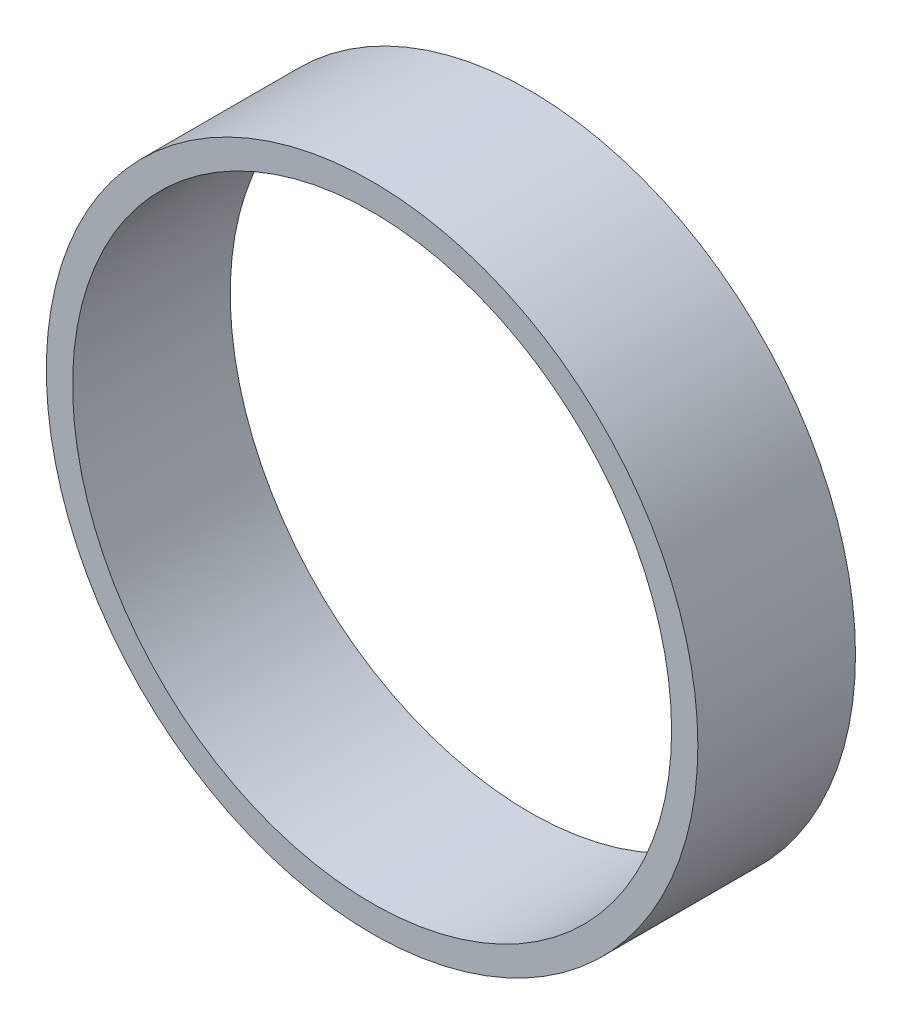
ISO-10303-21;
HEADER;
FILE_DESCRIPTION(('STEP AP214'),'2;1');
FILE_NAME('part.step','',(''),(''),'','','');
FILE_SCHEMA(('AUTOMOTIVE_DESIGN { 1 0 10303 214 1 1 1 1 }'));
ENDSEC;
DATA;
#1=APPLICATION_CONTEXT('core data for automotive mechanical design processes');
#2=APPLICATION_PROTOCOL_DEFINITION('international standard','automotive_design',2000,#1);
#3=PRODUCT_CONTEXT('',#1,'mechanical');
#4=PRODUCT('Part','Part','',(#3));
#5=PRODUCT_RELATED_PRODUCT_CATEGORY('part','',(#4));
#6=PRODUCT_DEFINITION_FORMATION('','',#4);
#7=PRODUCT_DEFINITION_CONTEXT('part definition',#1,'design');
#8=PRODUCT_DEFINITION('design','',#6,#7);
#9=PRODUCT_DEFINITION_SHAPE('','',#8);
#10=(LENGTH_UNIT() NAMED_UNIT(*) SI_UNIT(.MILLI.,.METRE.));
#11=(NAMED_UNIT(*) PLANE_ANGLE_UNIT() SI_UNIT($,.RADIAN.));
#12=(NAMED_UNIT(*) SI_UNIT($,.STERADIAN.) SOLID_ANGLE_UNIT());
#13=UNCERTAINTY_MEASURE_WITH_UNIT(LENGTH_MEASURE(1.E-05),#10,'distance_accuracy_value','');
#14=(GEOMETRIC_REPRESENTATION_CONTEXT(3) GLOBAL_UNCERTAINTY_ASSIGNED_CONTEXT((#13)) GLOBAL_UNIT_ASSIGNED_CONTEXT((#10,
#11,#12)) REPRESENTATION_CONTEXT('',''));
#15=CARTESIAN_POINT('',(0.,0.,0.));
#16=DIRECTION('',(0.,0.,1.));
#17=DIRECTION('',(1.,0.,0.));
#18=AXIS2_PLACEMENT_3D('',#15,#16,#17);
#19=CARTESIAN_POINT('',(0.,0.,15.));
#20=DIRECTION('',(0.,0.,1.));
#21=DIRECTION('',(1.,0.,0.));
#22=AXIS2_PLACEMENT_3D('',#19,#20,#21);
#23=PLANE('',#22);
#24=CARTESIAN_POINT('',(0.,0.,15.));
#25=DIRECTION('',(0.,0.,1.));
#26=DIRECTION('',(1.,0.,0.));
#27=AXIS2_PLACEMENT_3D('',#24,#25,#26);
#28=CIRCLE('',#27,31.);
#29=CARTESIAN_POINT('',(31.,0.,15.));
#30=VERTEX_POINT('',#29);
#31=EDGE_CURVE('E10',#30,#30,#28,.T.);
#32=ORIENTED_EDGE('',*,*,#31,.T.);
#33=EDGE_LOOP('',(#32));
#34=FACE_BOUND('',#33,.T.);
#35=CARTESIAN_POINT('',(0.,0.,15.));
#36=DIRECTION('',(0.,0.,1.));
#37=DIRECTION('',(1.,0.,0.));
#38=AXIS2_PLACEMENT_3D('',#35,#36,#37);
#39=CIRCLE('',#38,28.5);
#40=CARTESIAN_POINT('',(28.5,0.,15.));
#41=VERTEX_POINT('',#40);
#42=EDGE_CURVE('E48',#41,#41,#39,.T.);
#43=ORIENTED_EDGE('',*,*,#42,.F.);
#44=EDGE_LOOP('',(#43));
#45=FACE_BOUND('',#44,.T.);
#46=ADVANCED_FACE('F37',(#34,#45),#23,.T.);
#47=CARTESIAN_POINT('',(0.,0.,0.));
#48=DIRECTION('',(0.,0.,1.));
#49=DIRECTION('',(1.,0.,0.));
#50=AXIS2_PLACEMENT_3D('',#47,#48,#49);
#51=PLANE('',#50);
#52=CARTESIAN_POINT('',(0.,0.,0.));
#53=DIRECTION('',(0.,0.,1.));
#54=DIRECTION('',(1.,0.,0.));
#55=AXIS2_PLACEMENT_3D('',#52,#53,#54);
#56=CIRCLE('',#55,31.);
#57=CARTESIAN_POINT('',(31.,0.,0.));
#58=VERTEX_POINT('',#57);
#59=EDGE_CURVE('E41',#58,#58,#56,.T.);
#60=ORIENTED_EDGE('',*,*,#59,.F.);
#61=EDGE_LOOP('',(#60));
#62=FACE_BOUND('',#61,.T.);
#63=CARTESIAN_POINT('',(0.,0.,0.));
#64=DIRECTION('',(0.,0.,1.));
#65=DIRECTION('',(1.,0.,0.));
#66=AXIS2_PLACEMENT_3D('',#63,#64,#65);
#67=CIRCLE('',#66,28.5);
#68=CARTESIAN_POINT('',(28.5,0.,0.));
#69=VERTEX_POINT('',#68);
#70=EDGE_CURVE('E50',#69,#69,#67,.T.);
#71=ORIENTED_EDGE('',*,*,#70,.T.);
#72=EDGE_LOOP('',(#71));
#73=FACE_BOUND('',#72,.T.);
#74=ADVANCED_FACE('F60',(#62,#73),#51,.F.);
#75=CARTESIAN_POINT('',(0.,0.,15.));
#76=DIRECTION('',(0.,0.,-1.));
#77=DIRECTION('',(-1.,0.,0.));
#78=AXIS2_PLACEMENT_3D('',#75,#76,#77);
#79=CYLINDRICAL_SURFACE('',#78,31.);
#80=ORIENTED_EDGE('',*,*,#31,.F.);
#81=EDGE_LOOP('',(#80));
#82=FACE_BOUND('',#81,.T.);
#83=ORIENTED_EDGE('',*,*,#59,.T.);
#84=EDGE_LOOP('',(#83));
#85=FACE_BOUND('',#84,.T.);
#86=ADVANCED_FACE('F39',(#82,#85),#79,.T.);
#87=CARTESIAN_POINT('',(0.,0.,15.));
#88=DIRECTION('',(0.,0.,-1.));
#89=DIRECTION('',(-1.,0.,0.));
#90=AXIS2_PLACEMENT_3D('',#87,#88,#89);
#91=CYLINDRICAL_SURFACE('',#90,28.5);
#92=ORIENTED_EDGE('',*,*,#42,.T.);
#93=EDGE_LOOP('',(#92));
#94=FACE_BOUND('',#93,.T.);
#95=ORIENTED_EDGE('',*,*,#70,.F.);
#96=EDGE_LOOP('',(#95));
#97=FACE_BOUND('',#96,.T.);
#98=ADVANCED_FACE('F56',(#94,#97),#91,.F.);
#99=CLOSED_SHELL('',(#46,#74,#86,#98));
#100=MANIFOLD_SOLID_BREP('B2',#99);
#101=ADVANCED_BREP_SHAPE_REPRESENTATION('',(#18,#100),#14);
#102=SHAPE_DEFINITION_REPRESENTATION(#9,#101);
ENDSEC;
END-ISO-10303-21;
